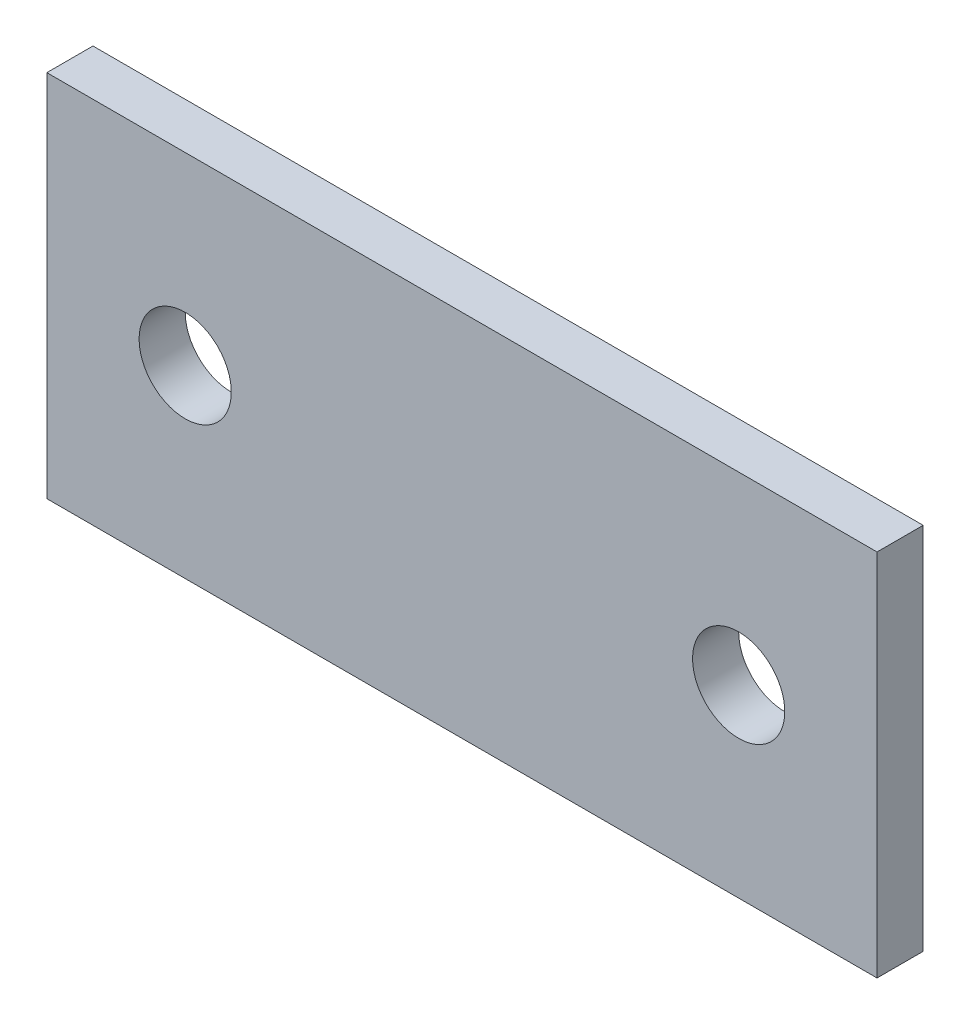
ISO-10303-21;
HEADER;
FILE_DESCRIPTION(('STEP AP214'),'2;1');
FILE_NAME('part.step','',(''),(''),'','','');
FILE_SCHEMA(('AUTOMOTIVE_DESIGN { 1 0 10303 214 1 1 1 1 }'));
ENDSEC;
DATA;
#1=APPLICATION_CONTEXT('core data for automotive mechanical design processes');
#2=APPLICATION_PROTOCOL_DEFINITION('international standard','automotive_design',2000,#1);
#3=PRODUCT_CONTEXT('',#1,'mechanical');
#4=PRODUCT('Part','Part','',(#3));
#5=PRODUCT_RELATED_PRODUCT_CATEGORY('part','',(#4));
#6=PRODUCT_DEFINITION_FORMATION('','',#4);
#7=PRODUCT_DEFINITION_CONTEXT('part definition',#1,'design');
#8=PRODUCT_DEFINITION('design','',#6,#7);
#9=PRODUCT_DEFINITION_SHAPE('','',#8);
#10=(LENGTH_UNIT() NAMED_UNIT(*) SI_UNIT(.MILLI.,.METRE.));
#11=(NAMED_UNIT(*) PLANE_ANGLE_UNIT() SI_UNIT($,.RADIAN.));
#12=(NAMED_UNIT(*) SI_UNIT($,.STERADIAN.) SOLID_ANGLE_UNIT());
#13=UNCERTAINTY_MEASURE_WITH_UNIT(LENGTH_MEASURE(1.E-05),#10,'distance_accuracy_value','');
#14=(GEOMETRIC_REPRESENTATION_CONTEXT(3) GLOBAL_UNCERTAINTY_ASSIGNED_CONTEXT((#13)) GLOBAL_UNIT_ASSIGNED_CONTEXT((#10,
#11,#12)) REPRESENTATION_CONTEXT('',''));
#15=CARTESIAN_POINT('',(0.,0.,0.));
#16=DIRECTION('',(0.,0.,1.));
#17=DIRECTION('',(1.,0.,0.));
#18=AXIS2_PLACEMENT_3D('',#15,#16,#17);
#19=CARTESIAN_POINT('',(0.,0.,10.));
#20=DIRECTION('',(0.,0.,1.));
#21=DIRECTION('',(1.,0.,0.));
#22=AXIS2_PLACEMENT_3D('',#19,#20,#21);
#23=PLANE('',#22);
#24=CARTESIAN_POINT('',(60.,0.,10.));
#25=DIRECTION('',(0.,0.,-1.));
#26=DIRECTION('',(1.,0.,0.));
#27=AXIS2_PLACEMENT_3D('',#24,#25,#26);
#28=CIRCLE('',#27,10.);
#29=CARTESIAN_POINT('',(50.,0.,10.));
#30=VERTEX_POINT('',#29);
#31=EDGE_CURVE('E122',#30,#30,#28,.T.);
#32=ORIENTED_EDGE('',*,*,#31,.T.);
#33=EDGE_LOOP('',(#32));
#34=FACE_BOUND('',#33,.T.);
#35=CARTESIAN_POINT('',(-60.,0.,10.));
#36=DIRECTION('',(0.,0.,-1.));
#37=DIRECTION('',(1.,0.,0.));
#38=AXIS2_PLACEMENT_3D('',#35,#36,#37);
#39=CIRCLE('',#38,10.);
#40=CARTESIAN_POINT('',(-70.,0.,10.));
#41=VERTEX_POINT('',#40);
#42=EDGE_CURVE('E118',#41,#41,#39,.T.);
#43=ORIENTED_EDGE('',*,*,#42,.T.);
#44=EDGE_LOOP('',(#43));
#45=FACE_BOUND('',#44,.T.);
#46=DIRECTION('',(-1.,0.,0.));
#47=VECTOR('',#46,1.);
#48=CARTESIAN_POINT('',(-90.,40.,10.));
#49=LINE('',#48,#47);
#50=CARTESIAN_POINT('',(90.,40.,10.));
#51=VERTEX_POINT('',#50);
#52=CARTESIAN_POINT('',(-90.,40.,10.));
#53=VERTEX_POINT('',#52);
#54=EDGE_CURVE('E11',#51,#53,#49,.T.);
#55=ORIENTED_EDGE('',*,*,#54,.T.);
#56=DIRECTION('',(0.,-1.,0.));
#57=VECTOR('',#56,1.);
#58=CARTESIAN_POINT('',(-90.,-40.,10.));
#59=LINE('',#58,#57);
#60=CARTESIAN_POINT('',(-90.,-40.,10.));
#61=VERTEX_POINT('',#60);
#62=EDGE_CURVE('E127',#53,#61,#59,.T.);
#63=ORIENTED_EDGE('',*,*,#62,.T.);
#64=DIRECTION('',(1.,0.,0.));
#65=VECTOR('',#64,1.);
#66=CARTESIAN_POINT('',(90.,-40.,10.));
#67=LINE('',#66,#65);
#68=CARTESIAN_POINT('',(90.,-40.,10.));
#69=VERTEX_POINT('',#68);
#70=EDGE_CURVE('E100',#61,#69,#67,.T.);
#71=ORIENTED_EDGE('',*,*,#70,.T.);
#72=DIRECTION('',(0.,1.,0.));
#73=VECTOR('',#72,1.);
#74=CARTESIAN_POINT('',(90.,40.,10.));
#75=LINE('',#74,#73);
#76=EDGE_CURVE('E98',#69,#51,#75,.T.);
#77=ORIENTED_EDGE('',*,*,#76,.T.);
#78=EDGE_LOOP('',(#55,#63,#71,#77));
#79=FACE_BOUND('',#78,.T.);
#80=ADVANCED_FACE('F17',(#34,#45,#79),#23,.T.);
#81=CARTESIAN_POINT('',(0.,0.,0.));
#82=DIRECTION('',(0.,0.,1.));
#83=DIRECTION('',(1.,0.,0.));
#84=AXIS2_PLACEMENT_3D('',#81,#82,#83);
#85=PLANE('',#84);
#86=CARTESIAN_POINT('',(60.,0.,0.));
#87=DIRECTION('',(0.,0.,1.));
#88=DIRECTION('',(1.,0.,0.));
#89=AXIS2_PLACEMENT_3D('',#86,#87,#88);
#90=CIRCLE('',#89,10.);
#91=CARTESIAN_POINT('',(50.,0.,0.));
#92=VERTEX_POINT('',#91);
#93=EDGE_CURVE('E114',#92,#92,#90,.T.);
#94=ORIENTED_EDGE('',*,*,#93,.T.);
#95=EDGE_LOOP('',(#94));
#96=FACE_BOUND('',#95,.T.);
#97=CARTESIAN_POINT('',(-60.,0.,0.));
#98=DIRECTION('',(0.,0.,1.));
#99=DIRECTION('',(1.,0.,0.));
#100=AXIS2_PLACEMENT_3D('',#97,#98,#99);
#101=CIRCLE('',#100,10.);
#102=CARTESIAN_POINT('',(-70.,0.,0.));
#103=VERTEX_POINT('',#102);
#104=EDGE_CURVE('E120',#103,#103,#101,.T.);
#105=ORIENTED_EDGE('',*,*,#104,.T.);
#106=EDGE_LOOP('',(#105));
#107=FACE_BOUND('',#106,.T.);
#108=DIRECTION('',(1.,0.,0.));
#109=VECTOR('',#108,1.);
#110=CARTESIAN_POINT('',(-90.,40.,0.));
#111=LINE('',#110,#109);
#112=CARTESIAN_POINT('',(-90.,40.,0.));
#113=VERTEX_POINT('',#112);
#114=CARTESIAN_POINT('',(90.,40.,0.));
#115=VERTEX_POINT('',#114);
#116=EDGE_CURVE('E28',#113,#115,#111,.T.);
#117=ORIENTED_EDGE('',*,*,#116,.T.);
#118=DIRECTION('',(0.,-1.,0.));
#119=VECTOR('',#118,1.);
#120=CARTESIAN_POINT('',(90.,40.,0.));
#121=LINE('',#120,#119);
#122=CARTESIAN_POINT('',(90.,-40.,0.));
#123=VERTEX_POINT('',#122);
#124=EDGE_CURVE('E107',#115,#123,#121,.T.);
#125=ORIENTED_EDGE('',*,*,#124,.T.);
#126=DIRECTION('',(-1.,0.,0.));
#127=VECTOR('',#126,1.);
#128=CARTESIAN_POINT('',(90.,-40.,0.));
#129=LINE('',#128,#127);
#130=CARTESIAN_POINT('',(-90.,-40.,0.));
#131=VERTEX_POINT('',#130);
#132=EDGE_CURVE('E84',#123,#131,#129,.T.);
#133=ORIENTED_EDGE('',*,*,#132,.T.);
#134=DIRECTION('',(0.,1.,0.));
#135=VECTOR('',#134,1.);
#136=CARTESIAN_POINT('',(-90.,-40.,0.));
#137=LINE('',#136,#135);
#138=EDGE_CURVE('E124',#131,#113,#137,.T.);
#139=ORIENTED_EDGE('',*,*,#138,.T.);
#140=EDGE_LOOP('',(#117,#125,#133,#139));
#141=FACE_BOUND('',#140,.T.);
#142=ADVANCED_FACE('F169',(#96,#107,#141),#85,.F.);
#143=CARTESIAN_POINT('',(90.,40.,0.));
#144=DIRECTION('',(0.,1.,0.));
#145=DIRECTION('',(1.,0.,0.));
#146=AXIS2_PLACEMENT_3D('',#143,#144,#145);
#147=PLANE('',#146);
#148=ORIENTED_EDGE('',*,*,#116,.F.);
#149=DIRECTION('',(0.,0.,1.));
#150=VECTOR('',#149,1.);
#151=CARTESIAN_POINT('',(-90.,40.,0.));
#152=LINE('',#151,#150);
#153=EDGE_CURVE('E95',#113,#53,#152,.T.);
#154=ORIENTED_EDGE('',*,*,#153,.T.);
#155=ORIENTED_EDGE('',*,*,#54,.F.);
#156=DIRECTION('',(0.,0.,1.));
#157=VECTOR('',#156,1.);
#158=CARTESIAN_POINT('',(90.,40.,0.));
#159=LINE('',#158,#157);
#160=EDGE_CURVE('E92',#115,#51,#159,.T.);
#161=ORIENTED_EDGE('',*,*,#160,.F.);
#162=EDGE_LOOP('',(#148,#154,#155,#161));
#163=FACE_BOUND('',#162,.T.);
#164=ADVANCED_FACE('F90',(#163),#147,.T.);
#165=CARTESIAN_POINT('',(-90.,40.,0.));
#166=DIRECTION('',(-1.,0.,0.));
#167=DIRECTION('',(0.,0.,1.));
#168=AXIS2_PLACEMENT_3D('',#165,#166,#167);
#169=PLANE('',#168);
#170=ORIENTED_EDGE('',*,*,#138,.F.);
#171=DIRECTION('',(0.,0.,1.));
#172=VECTOR('',#171,1.);
#173=CARTESIAN_POINT('',(-90.,-40.,0.));
#174=LINE('',#173,#172);
#175=EDGE_CURVE('E21',#131,#61,#174,.T.);
#176=ORIENTED_EDGE('',*,*,#175,.T.);
#177=ORIENTED_EDGE('',*,*,#62,.F.);
#178=ORIENTED_EDGE('',*,*,#153,.F.);
#179=EDGE_LOOP('',(#170,#176,#177,#178));
#180=FACE_BOUND('',#179,.T.);
#181=ADVANCED_FACE('F247',(#180),#169,.T.);
#182=CARTESIAN_POINT('',(-90.,-40.,0.));
#183=DIRECTION('',(0.,-1.,0.));
#184=DIRECTION('',(-1.,0.,0.));
#185=AXIS2_PLACEMENT_3D('',#182,#183,#184);
#186=PLANE('',#185);
#187=ORIENTED_EDGE('',*,*,#132,.F.);
#188=DIRECTION('',(0.,0.,1.));
#189=VECTOR('',#188,1.);
#190=CARTESIAN_POINT('',(90.,-40.,0.));
#191=LINE('',#190,#189);
#192=EDGE_CURVE('E103',#123,#69,#191,.T.);
#193=ORIENTED_EDGE('',*,*,#192,.T.);
#194=ORIENTED_EDGE('',*,*,#70,.F.);
#195=ORIENTED_EDGE('',*,*,#175,.F.);
#196=EDGE_LOOP('',(#187,#193,#194,#195));
#197=FACE_BOUND('',#196,.T.);
#198=ADVANCED_FACE('F237',(#197),#186,.T.);
#199=CARTESIAN_POINT('',(90.,-40.,0.));
#200=DIRECTION('',(1.,0.,0.));
#201=DIRECTION('',(0.,1.,0.));
#202=AXIS2_PLACEMENT_3D('',#199,#200,#201);
#203=PLANE('',#202);
#204=ORIENTED_EDGE('',*,*,#124,.F.);
#205=ORIENTED_EDGE('',*,*,#160,.T.);
#206=ORIENTED_EDGE('',*,*,#76,.F.);
#207=ORIENTED_EDGE('',*,*,#192,.F.);
#208=EDGE_LOOP('',(#204,#205,#206,#207));
#209=FACE_BOUND('',#208,.T.);
#210=ADVANCED_FACE('F105',(#209),#203,.T.);
#211=CARTESIAN_POINT('',(60.,0.,-187.23082923316));
#212=DIRECTION('',(0.,0.,1.));
#213=DIRECTION('',(1.,0.,0.));
#214=AXIS2_PLACEMENT_3D('',#211,#212,#213);
#215=CYLINDRICAL_SURFACE('',#214,10.);
#216=ORIENTED_EDGE('',*,*,#31,.F.);
#217=DIRECTION('',(0.,0.,-1.));
#218=VECTOR('',#217,1.);
#219=CARTESIAN_POINT('',(50.,0.,-187.23082923316));
#220=LINE('',#219,#218);
#221=EDGE_CURVE('E153',#30,#92,#220,.T.);
#222=ORIENTED_EDGE('',*,*,#221,.T.);
#223=ORIENTED_EDGE('',*,*,#93,.F.);
#224=ORIENTED_EDGE('',*,*,#221,.F.);
#225=EDGE_LOOP('',(#216,#222,#223,#224));
#226=FACE_BOUND('',#225,.T.);
#227=ADVANCED_FACE('F19',(#226),#215,.F.);
#228=CARTESIAN_POINT('',(-60.,0.,-187.23082923316));
#229=DIRECTION('',(0.,0.,1.));
#230=DIRECTION('',(1.,0.,0.));
#231=AXIS2_PLACEMENT_3D('',#228,#229,#230);
#232=CYLINDRICAL_SURFACE('',#231,10.);
#233=ORIENTED_EDGE('',*,*,#42,.F.);
#234=DIRECTION('',(0.,0.,-1.));
#235=VECTOR('',#234,1.);
#236=CARTESIAN_POINT('',(-70.,0.,-187.23082923316));
#237=LINE('',#236,#235);
#238=EDGE_CURVE('E123',#41,#103,#237,.T.);
#239=ORIENTED_EDGE('',*,*,#238,.T.);
#240=ORIENTED_EDGE('',*,*,#104,.F.);
#241=ORIENTED_EDGE('',*,*,#238,.F.);
#242=EDGE_LOOP('',(#233,#239,#240,#241));
#243=FACE_BOUND('',#242,.T.);
#244=ADVANCED_FACE('F211',(#243),#232,.F.);
#245=CLOSED_SHELL('',(#80,#142,#164,#181,#198,#210,#227,#244));
#246=MANIFOLD_SOLID_BREP('B1',#245);
#247=ADVANCED_BREP_SHAPE_REPRESENTATION('',(#18,#246),#14);
#248=SHAPE_DEFINITION_REPRESENTATION(#9,#247);
ENDSEC;
END-ISO-10303-21;
